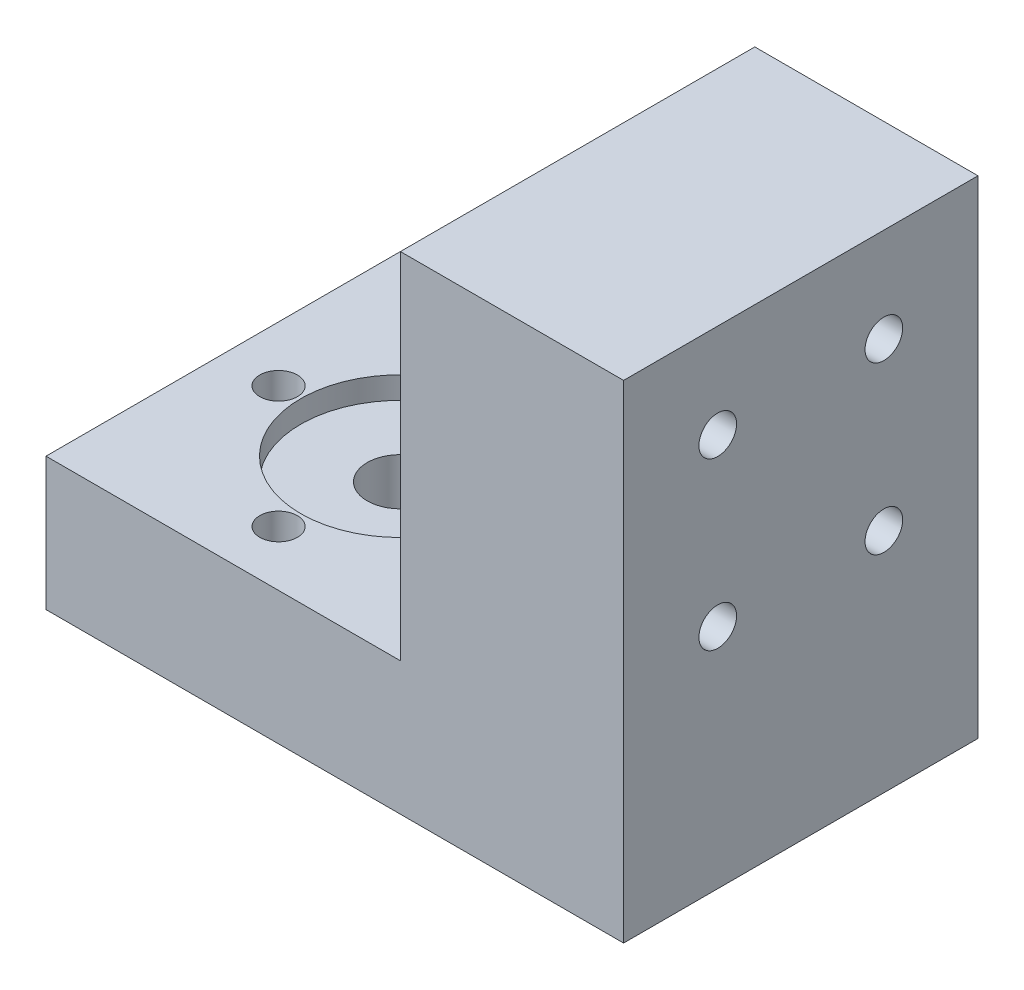
ISO-10303-21;
HEADER;
FILE_DESCRIPTION(('STEP AP214'),'2;1');
FILE_NAME('part.step','',(''),(''),'','','');
FILE_SCHEMA(('AUTOMOTIVE_DESIGN { 1 0 10303 214 1 1 1 1 }'));
ENDSEC;
DATA;
#1=APPLICATION_CONTEXT('core data for automotive mechanical design processes');
#2=APPLICATION_PROTOCOL_DEFINITION('international standard','automotive_design',2000,#1);
#3=PRODUCT_CONTEXT('',#1,'mechanical');
#4=PRODUCT('Part','Part','',(#3));
#5=PRODUCT_RELATED_PRODUCT_CATEGORY('part','',(#4));
#6=PRODUCT_DEFINITION_FORMATION('','',#4);
#7=PRODUCT_DEFINITION_CONTEXT('part definition',#1,'design');
#8=PRODUCT_DEFINITION('design','',#6,#7);
#9=PRODUCT_DEFINITION_SHAPE('','',#8);
#10=(LENGTH_UNIT() NAMED_UNIT(*) SI_UNIT(.MILLI.,.METRE.));
#11=(NAMED_UNIT(*) PLANE_ANGLE_UNIT() SI_UNIT($,.RADIAN.));
#12=(NAMED_UNIT(*) SI_UNIT($,.STERADIAN.) SOLID_ANGLE_UNIT());
#13=UNCERTAINTY_MEASURE_WITH_UNIT(LENGTH_MEASURE(1.E-05),#10,'distance_accuracy_value','');
#14=(GEOMETRIC_REPRESENTATION_CONTEXT(3) GLOBAL_UNCERTAINTY_ASSIGNED_CONTEXT((#13)) GLOBAL_UNIT_ASSIGNED_CONTEXT((#10,
#11,#12)) REPRESENTATION_CONTEXT('',''));
#15=CARTESIAN_POINT('',(0.,0.,0.));
#16=DIRECTION('',(0.,0.,1.));
#17=DIRECTION('',(1.,0.,0.));
#18=AXIS2_PLACEMENT_3D('',#15,#16,#17);
#19=CARTESIAN_POINT('',(0.,12.,0.));
#20=DIRECTION('',(-1.,0.,0.));
#21=DIRECTION('',(0.,0.,1.));
#22=AXIS2_PLACEMENT_3D('',#19,#20,#21);
#23=PLANE('',#22);
#24=DIRECTION('',(0.,0.,-1.));
#25=VECTOR('',#24,1.);
#26=CARTESIAN_POINT('',(0.,0.,0.));
#27=LINE('',#26,#25);
#28=CARTESIAN_POINT('',(0.,0.,0.));
#29=VERTEX_POINT('',#28);
#30=CARTESIAN_POINT('',(0.,0.,-32.));
#31=VERTEX_POINT('',#30);
#32=EDGE_CURVE('E120',#29,#31,#27,.T.);
#33=ORIENTED_EDGE('',*,*,#32,.F.);
#34=DIRECTION('',(0.,-1.,0.));
#35=VECTOR('',#34,1.);
#36=CARTESIAN_POINT('',(0.,12.,0.));
#37=LINE('',#36,#35);
#38=CARTESIAN_POINT('',(0.,12.,0.));
#39=VERTEX_POINT('',#38);
#40=EDGE_CURVE('E11',#39,#29,#37,.T.);
#41=ORIENTED_EDGE('',*,*,#40,.F.);
#42=DIRECTION('',(0.,0.,-1.));
#43=VECTOR('',#42,1.);
#44=CARTESIAN_POINT('',(0.,12.,0.));
#45=LINE('',#44,#43);
#46=CARTESIAN_POINT('',(0.,12.,-32.));
#47=VERTEX_POINT('',#46);
#48=EDGE_CURVE('E103',#39,#47,#45,.T.);
#49=ORIENTED_EDGE('',*,*,#48,.T.);
#50=DIRECTION('',(0.,-1.,0.));
#51=VECTOR('',#50,1.);
#52=CARTESIAN_POINT('',(0.,12.,-32.));
#53=LINE('',#52,#51);
#54=EDGE_CURVE('E50',#47,#31,#53,.T.);
#55=ORIENTED_EDGE('',*,*,#54,.T.);
#56=EDGE_LOOP('',(#33,#41,#49,#55));
#57=FACE_BOUND('',#56,.T.);
#58=ADVANCED_FACE('F47',(#57),#23,.T.);
#59=CARTESIAN_POINT('',(0.,12.,0.));
#60=DIRECTION('',(0.,0.,-1.));
#61=DIRECTION('',(-1.,0.,0.));
#62=AXIS2_PLACEMENT_3D('',#59,#60,#61);
#63=PLANE('',#62);
#64=DIRECTION('',(1.,0.,0.));
#65=VECTOR('',#64,1.);
#66=CARTESIAN_POINT('',(0.,0.,0.));
#67=LINE('',#66,#65);
#68=CARTESIAN_POINT('',(52.1521725722602,0.,0.));
#69=VERTEX_POINT('',#68);
#70=EDGE_CURVE('E107',#29,#69,#67,.T.);
#71=ORIENTED_EDGE('',*,*,#70,.T.);
#72=DIRECTION('',(0.,-1.,0.));
#73=VECTOR('',#72,1.);
#74=CARTESIAN_POINT('',(52.1521725722602,0.,0.));
#75=LINE('',#74,#73);
#76=CARTESIAN_POINT('',(52.1521725722602,44.,0.));
#77=VERTEX_POINT('',#76);
#78=EDGE_CURVE('E141',#77,#69,#75,.T.);
#79=ORIENTED_EDGE('',*,*,#78,.F.);
#80=DIRECTION('',(-1.,0.,0.));
#81=VECTOR('',#80,1.);
#82=CARTESIAN_POINT('',(52.1521725722602,44.,0.));
#83=LINE('',#82,#81);
#84=CARTESIAN_POINT('',(32.,44.,0.));
#85=VERTEX_POINT('',#84);
#86=EDGE_CURVE('E151',#77,#85,#83,.T.);
#87=ORIENTED_EDGE('',*,*,#86,.T.);
#88=DIRECTION('',(0.,-1.,0.));
#89=VECTOR('',#88,1.);
#90=CARTESIAN_POINT('',(32.,0.,0.));
#91=LINE('',#90,#89);
#92=CARTESIAN_POINT('',(32.,12.,0.));
#93=VERTEX_POINT('',#92);
#94=EDGE_CURVE('E155',#85,#93,#91,.T.);
#95=ORIENTED_EDGE('',*,*,#94,.T.);
#96=DIRECTION('',(1.,0.,0.));
#97=VECTOR('',#96,1.);
#98=CARTESIAN_POINT('',(0.,12.,0.));
#99=LINE('',#98,#97);
#100=EDGE_CURVE('E98',#39,#93,#99,.T.);
#101=ORIENTED_EDGE('',*,*,#100,.F.);
#102=ORIENTED_EDGE('',*,*,#40,.T.);
#103=EDGE_LOOP('',(#71,#79,#87,#95,#101,#102));
#104=FACE_BOUND('',#103,.T.);
#105=ADVANCED_FACE('F229',(#104),#63,.F.);
#106=CARTESIAN_POINT('',(0.,12.,-32.));
#107=DIRECTION('',(0.,0.,-1.));
#108=DIRECTION('',(-1.,0.,0.));
#109=AXIS2_PLACEMENT_3D('',#106,#107,#108);
#110=PLANE('',#109);
#111=DIRECTION('',(1.,0.,0.));
#112=VECTOR('',#111,1.);
#113=CARTESIAN_POINT('',(0.,0.,-32.));
#114=LINE('',#113,#112);
#115=CARTESIAN_POINT('',(52.1521725722602,0.,-32.));
#116=VERTEX_POINT('',#115);
#117=EDGE_CURVE('E95',#31,#116,#114,.T.);
#118=ORIENTED_EDGE('',*,*,#117,.F.);
#119=ORIENTED_EDGE('',*,*,#54,.F.);
#120=DIRECTION('',(1.,0.,0.));
#121=VECTOR('',#120,1.);
#122=CARTESIAN_POINT('',(0.,12.,-32.));
#123=LINE('',#122,#121);
#124=CARTESIAN_POINT('',(32.,12.,-32.));
#125=VERTEX_POINT('',#124);
#126=EDGE_CURVE('E92',#47,#125,#123,.T.);
#127=ORIENTED_EDGE('',*,*,#126,.T.);
#128=DIRECTION('',(0.,1.,0.));
#129=VECTOR('',#128,1.);
#130=CARTESIAN_POINT('',(32.,0.,-32.));
#131=LINE('',#130,#129);
#132=CARTESIAN_POINT('',(32.,44.,-32.));
#133=VERTEX_POINT('',#132);
#134=EDGE_CURVE('E158',#125,#133,#131,.T.);
#135=ORIENTED_EDGE('',*,*,#134,.T.);
#136=DIRECTION('',(-1.,0.,0.));
#137=VECTOR('',#136,1.);
#138=CARTESIAN_POINT('',(52.1521725722602,44.,-32.));
#139=LINE('',#138,#137);
#140=CARTESIAN_POINT('',(52.1521725722602,44.,-32.));
#141=VERTEX_POINT('',#140);
#142=EDGE_CURVE('E145',#141,#133,#139,.T.);
#143=ORIENTED_EDGE('',*,*,#142,.F.);
#144=DIRECTION('',(0.,1.,0.));
#145=VECTOR('',#144,1.);
#146=CARTESIAN_POINT('',(52.1521725722602,0.,-32.));
#147=LINE('',#146,#145);
#148=EDGE_CURVE('E138',#116,#141,#147,.T.);
#149=ORIENTED_EDGE('',*,*,#148,.F.);
#150=EDGE_LOOP('',(#118,#119,#127,#135,#143,#149));
#151=FACE_BOUND('',#150,.T.);
#152=ADVANCED_FACE('F90',(#151),#110,.T.);
#153=CARTESIAN_POINT('',(0.,12.,0.));
#154=DIRECTION('',(0.,-1.,0.));
#155=DIRECTION('',(0.,0.,-1.));
#156=AXIS2_PLACEMENT_3D('',#153,#154,#155);
#157=PLANE('',#156);
#158=CARTESIAN_POINT('',(16.,12.,-27.));
#159=DIRECTION('',(0.,1.,0.));
#160=DIRECTION('',(0.,0.,1.));
#161=AXIS2_PLACEMENT_3D('',#158,#159,#160);
#162=CIRCLE('',#161,1.7);
#163=CARTESIAN_POINT('',(16.,12.,-25.3));
#164=VERTEX_POINT('',#163);
#165=EDGE_CURVE('E177',#164,#164,#162,.T.);
#166=ORIENTED_EDGE('',*,*,#165,.F.);
#167=EDGE_LOOP('',(#166));
#168=FACE_BOUND('',#167,.T.);
#169=CARTESIAN_POINT('',(27.,12.,-16.));
#170=DIRECTION('',(0.,1.,0.));
#171=DIRECTION('',(0.,0.,1.));
#172=AXIS2_PLACEMENT_3D('',#169,#170,#171);
#173=CIRCLE('',#172,1.7);
#174=CARTESIAN_POINT('',(27.,12.,-14.3));
#175=VERTEX_POINT('',#174);
#176=EDGE_CURVE('E181',#175,#175,#173,.T.);
#177=ORIENTED_EDGE('',*,*,#176,.F.);
#178=EDGE_LOOP('',(#177));
#179=FACE_BOUND('',#178,.T.);
#180=CARTESIAN_POINT('',(16.,12.,-5.00000000000002));
#181=DIRECTION('',(0.,1.,0.));
#182=DIRECTION('',(0.,0.,1.));
#183=AXIS2_PLACEMENT_3D('',#180,#181,#182);
#184=CIRCLE('',#183,1.7);
#185=CARTESIAN_POINT('',(16.,12.,-3.30000000000002));
#186=VERTEX_POINT('',#185);
#187=EDGE_CURVE('E189',#186,#186,#184,.T.);
#188=ORIENTED_EDGE('',*,*,#187,.F.);
#189=EDGE_LOOP('',(#188));
#190=FACE_BOUND('',#189,.T.);
#191=CARTESIAN_POINT('',(5.00000000000002,12.,-16.));
#192=DIRECTION('',(0.,1.,0.));
#193=DIRECTION('',(0.,0.,1.));
#194=AXIS2_PLACEMENT_3D('',#191,#192,#193);
#195=CIRCLE('',#194,1.7);
#196=CARTESIAN_POINT('',(5.00000000000002,12.,-14.3));
#197=VERTEX_POINT('',#196);
#198=EDGE_CURVE('E197',#197,#197,#195,.T.);
#199=ORIENTED_EDGE('',*,*,#198,.F.);
#200=EDGE_LOOP('',(#199));
#201=FACE_BOUND('',#200,.T.);
#202=CARTESIAN_POINT('',(16.,12.,-16.));
#203=DIRECTION('',(0.,1.,0.));
#204=DIRECTION('',(0.,0.,1.));
#205=AXIS2_PLACEMENT_3D('',#202,#203,#204);
#206=CIRCLE('',#205,9.);
#207=CARTESIAN_POINT('',(16.,12.,-7.00000000000001));
#208=VERTEX_POINT('',#207);
#209=EDGE_CURVE('E113',#208,#208,#206,.T.);
#210=ORIENTED_EDGE('',*,*,#209,.F.);
#211=EDGE_LOOP('',(#210));
#212=FACE_BOUND('',#211,.T.);
#213=ORIENTED_EDGE('',*,*,#48,.F.);
#214=ORIENTED_EDGE('',*,*,#100,.T.);
#215=DIRECTION('',(0.,0.,-1.));
#216=VECTOR('',#215,1.);
#217=CARTESIAN_POINT('',(32.,12.,0.));
#218=LINE('',#217,#216);
#219=EDGE_CURVE('E79',#93,#125,#218,.T.);
#220=ORIENTED_EDGE('',*,*,#219,.T.);
#221=ORIENTED_EDGE('',*,*,#126,.F.);
#222=EDGE_LOOP('',(#213,#214,#220,#221));
#223=FACE_BOUND('',#222,.T.);
#224=ADVANCED_FACE('F101',(#168,#179,#190,#201,#212,#223),#157,.F.);
#225=CARTESIAN_POINT('',(0.,0.,0.));
#226=DIRECTION('',(0.,-1.,0.));
#227=DIRECTION('',(0.,0.,-1.));
#228=AXIS2_PLACEMENT_3D('',#225,#226,#227);
#229=PLANE('',#228);
#230=CARTESIAN_POINT('',(16.,0.,-27.));
#231=DIRECTION('',(0.,1.,0.));
#232=DIRECTION('',(0.,0.,1.));
#233=AXIS2_PLACEMENT_3D('',#230,#231,#232);
#234=CIRCLE('',#233,1.7);
#235=CARTESIAN_POINT('',(16.,0.,-25.3));
#236=VERTEX_POINT('',#235);
#237=EDGE_CURVE('E172',#236,#236,#234,.T.);
#238=ORIENTED_EDGE('',*,*,#237,.T.);
#239=EDGE_LOOP('',(#238));
#240=FACE_BOUND('',#239,.T.);
#241=CARTESIAN_POINT('',(27.,0.,-16.));
#242=DIRECTION('',(0.,1.,0.));
#243=DIRECTION('',(0.,0.,1.));
#244=AXIS2_PLACEMENT_3D('',#241,#242,#243);
#245=CIRCLE('',#244,1.7);
#246=CARTESIAN_POINT('',(27.,0.,-14.3));
#247=VERTEX_POINT('',#246);
#248=EDGE_CURVE('E185',#247,#247,#245,.T.);
#249=ORIENTED_EDGE('',*,*,#248,.T.);
#250=EDGE_LOOP('',(#249));
#251=FACE_BOUND('',#250,.T.);
#252=CARTESIAN_POINT('',(16.,0.,-5.00000000000002));
#253=DIRECTION('',(0.,1.,0.));
#254=DIRECTION('',(0.,0.,1.));
#255=AXIS2_PLACEMENT_3D('',#252,#253,#254);
#256=CIRCLE('',#255,1.7);
#257=CARTESIAN_POINT('',(16.,0.,-3.30000000000002));
#258=VERTEX_POINT('',#257);
#259=EDGE_CURVE('E193',#258,#258,#256,.T.);
#260=ORIENTED_EDGE('',*,*,#259,.T.);
#261=EDGE_LOOP('',(#260));
#262=FACE_BOUND('',#261,.T.);
#263=CARTESIAN_POINT('',(5.00000000000002,0.,-16.));
#264=DIRECTION('',(0.,1.,0.));
#265=DIRECTION('',(0.,0.,1.));
#266=AXIS2_PLACEMENT_3D('',#263,#264,#265);
#267=CIRCLE('',#266,1.7);
#268=CARTESIAN_POINT('',(5.00000000000002,0.,-14.3));
#269=VERTEX_POINT('',#268);
#270=EDGE_CURVE('E171',#269,#269,#267,.T.);
#271=ORIENTED_EDGE('',*,*,#270,.T.);
#272=EDGE_LOOP('',(#271));
#273=FACE_BOUND('',#272,.T.);
#274=CARTESIAN_POINT('',(16.,0.,-16.));
#275=DIRECTION('',(0.,1.,0.));
#276=DIRECTION('',(0.,0.,1.));
#277=AXIS2_PLACEMENT_3D('',#274,#275,#276);
#278=CIRCLE('',#277,3.);
#279=CARTESIAN_POINT('',(16.,0.,-13.));
#280=VERTEX_POINT('',#279);
#281=EDGE_CURVE('E204',#280,#280,#278,.T.);
#282=ORIENTED_EDGE('',*,*,#281,.T.);
#283=EDGE_LOOP('',(#282));
#284=FACE_BOUND('',#283,.T.);
#285=ORIENTED_EDGE('',*,*,#32,.T.);
#286=ORIENTED_EDGE('',*,*,#117,.T.);
#287=DIRECTION('',(0.,0.,-1.));
#288=VECTOR('',#287,1.);
#289=CARTESIAN_POINT('',(52.1521725722602,0.,0.));
#290=LINE('',#289,#288);
#291=EDGE_CURVE('E132',#69,#116,#290,.T.);
#292=ORIENTED_EDGE('',*,*,#291,.F.);
#293=ORIENTED_EDGE('',*,*,#70,.F.);
#294=EDGE_LOOP('',(#285,#286,#292,#293));
#295=FACE_BOUND('',#294,.T.);
#296=ADVANCED_FACE('F129',(#240,#251,#262,#273,#284,#295),#229,.T.);
#297=CARTESIAN_POINT('',(16.,10.,-16.));
#298=DIRECTION('',(0.,1.,0.));
#299=DIRECTION('',(0.,0.,1.));
#300=AXIS2_PLACEMENT_3D('',#297,#298,#299);
#301=CYLINDRICAL_SURFACE('',#300,9.);
#302=CARTESIAN_POINT('',(16.,10.,-16.));
#303=DIRECTION('',(0.,1.,0.));
#304=DIRECTION('',(0.,0.,1.));
#305=AXIS2_PLACEMENT_3D('',#302,#303,#304);
#306=CIRCLE('',#305,9.);
#307=CARTESIAN_POINT('',(16.,10.,-7.00000000000001));
#308=VERTEX_POINT('',#307);
#309=EDGE_CURVE('E123',#308,#308,#306,.T.);
#310=ORIENTED_EDGE('',*,*,#309,.F.);
#311=EDGE_LOOP('',(#310));
#312=FACE_BOUND('',#311,.T.);
#313=ORIENTED_EDGE('',*,*,#209,.T.);
#314=EDGE_LOOP('',(#313));
#315=FACE_BOUND('',#314,.T.);
#316=ADVANCED_FACE('F218',(#312,#315),#301,.F.);
#317=CARTESIAN_POINT('',(16.,10.,-16.));
#318=DIRECTION('',(0.,1.,0.));
#319=DIRECTION('',(0.,0.,1.));
#320=AXIS2_PLACEMENT_3D('',#317,#318,#319);
#321=PLANE('',#320);
#322=CARTESIAN_POINT('',(16.,10.,-16.));
#323=DIRECTION('',(0.,1.,0.));
#324=DIRECTION('',(0.,0.,1.));
#325=AXIS2_PLACEMENT_3D('',#322,#323,#324);
#326=CIRCLE('',#325,3.);
#327=CARTESIAN_POINT('',(16.,10.,-13.));
#328=VERTEX_POINT('',#327);
#329=EDGE_CURVE('E176',#328,#328,#326,.T.);
#330=ORIENTED_EDGE('',*,*,#329,.F.);
#331=EDGE_LOOP('',(#330));
#332=FACE_BOUND('',#331,.T.);
#333=ORIENTED_EDGE('',*,*,#309,.T.);
#334=EDGE_LOOP('',(#333));
#335=FACE_BOUND('',#334,.T.);
#336=ADVANCED_FACE('F282',(#332,#335),#321,.T.);
#337=CARTESIAN_POINT('',(16.,0.,-16.));
#338=DIRECTION('',(0.,1.,0.));
#339=DIRECTION('',(0.,0.,1.));
#340=AXIS2_PLACEMENT_3D('',#337,#338,#339);
#341=CYLINDRICAL_SURFACE('',#340,3.);
#342=ORIENTED_EDGE('',*,*,#281,.F.);
#343=EDGE_LOOP('',(#342));
#344=FACE_BOUND('',#343,.T.);
#345=ORIENTED_EDGE('',*,*,#329,.T.);
#346=EDGE_LOOP('',(#345));
#347=FACE_BOUND('',#346,.T.);
#348=ADVANCED_FACE('F278',(#344,#347),#341,.F.);
#349=CARTESIAN_POINT('',(5.00000000000002,0.,-16.));
#350=DIRECTION('',(0.,1.,0.));
#351=DIRECTION('',(0.,0.,1.));
#352=AXIS2_PLACEMENT_3D('',#349,#350,#351);
#353=CYLINDRICAL_SURFACE('',#352,1.7);
#354=ORIENTED_EDGE('',*,*,#270,.F.);
#355=EDGE_LOOP('',(#354));
#356=FACE_BOUND('',#355,.T.);
#357=ORIENTED_EDGE('',*,*,#198,.T.);
#358=EDGE_LOOP('',(#357));
#359=FACE_BOUND('',#358,.T.);
#360=ADVANCED_FACE('F274',(#356,#359),#353,.F.);
#361=CARTESIAN_POINT('',(16.,0.,-5.00000000000002));
#362=DIRECTION('',(0.,1.,0.));
#363=DIRECTION('',(0.,0.,1.));
#364=AXIS2_PLACEMENT_3D('',#361,#362,#363);
#365=CYLINDRICAL_SURFACE('',#364,1.7);
#366=ORIENTED_EDGE('',*,*,#259,.F.);
#367=EDGE_LOOP('',(#366));
#368=FACE_BOUND('',#367,.T.);
#369=ORIENTED_EDGE('',*,*,#187,.T.);
#370=EDGE_LOOP('',(#369));
#371=FACE_BOUND('',#370,.T.);
#372=ADVANCED_FACE('F270',(#368,#371),#365,.F.);
#373=CARTESIAN_POINT('',(27.,0.,-16.));
#374=DIRECTION('',(0.,1.,0.));
#375=DIRECTION('',(0.,0.,1.));
#376=AXIS2_PLACEMENT_3D('',#373,#374,#375);
#377=CYLINDRICAL_SURFACE('',#376,1.7);
#378=ORIENTED_EDGE('',*,*,#248,.F.);
#379=EDGE_LOOP('',(#378));
#380=FACE_BOUND('',#379,.T.);
#381=ORIENTED_EDGE('',*,*,#176,.T.);
#382=EDGE_LOOP('',(#381));
#383=FACE_BOUND('',#382,.T.);
#384=ADVANCED_FACE('F260',(#380,#383),#377,.F.);
#385=CARTESIAN_POINT('',(16.,0.,-27.));
#386=DIRECTION('',(0.,1.,0.));
#387=DIRECTION('',(0.,0.,1.));
#388=AXIS2_PLACEMENT_3D('',#385,#386,#387);
#389=CYLINDRICAL_SURFACE('',#388,1.7);
#390=ORIENTED_EDGE('',*,*,#237,.F.);
#391=EDGE_LOOP('',(#390));
#392=FACE_BOUND('',#391,.T.);
#393=ORIENTED_EDGE('',*,*,#165,.T.);
#394=EDGE_LOOP('',(#393));
#395=FACE_BOUND('',#394,.T.);
#396=ADVANCED_FACE('F252',(#392,#395),#389,.F.);
#397=CARTESIAN_POINT('',(32.,0.,0.));
#398=DIRECTION('',(-1.,0.,0.));
#399=DIRECTION('',(0.,0.,1.));
#400=AXIS2_PLACEMENT_3D('',#397,#398,#399);
#401=PLANE('',#400);
#402=CARTESIAN_POINT('',(32.,20.5,-23.5));
#403=DIRECTION('',(-1.,0.,0.));
#404=DIRECTION('',(0.,0.,1.));
#405=AXIS2_PLACEMENT_3D('',#402,#403,#404);
#406=CIRCLE('',#405,1.7);
#407=CARTESIAN_POINT('',(32.,20.5,-21.8));
#408=VERTEX_POINT('',#407);
#409=EDGE_CURVE('E406',#408,#408,#406,.T.);
#410=ORIENTED_EDGE('',*,*,#409,.F.);
#411=EDGE_LOOP('',(#410));
#412=FACE_BOUND('',#411,.T.);
#413=CARTESIAN_POINT('',(32.,20.5,-8.50000000000001));
#414=DIRECTION('',(-1.,0.,0.));
#415=DIRECTION('',(0.,0.,1.));
#416=AXIS2_PLACEMENT_3D('',#413,#414,#415);
#417=CIRCLE('',#416,1.7);
#418=CARTESIAN_POINT('',(32.,20.5,-6.80000000000001));
#419=VERTEX_POINT('',#418);
#420=EDGE_CURVE('E413',#419,#419,#417,.T.);
#421=ORIENTED_EDGE('',*,*,#420,.F.);
#422=EDGE_LOOP('',(#421));
#423=FACE_BOUND('',#422,.T.);
#424=CARTESIAN_POINT('',(32.,35.5,-8.50000000000001));
#425=DIRECTION('',(-1.,0.,0.));
#426=DIRECTION('',(0.,0.,1.));
#427=AXIS2_PLACEMENT_3D('',#424,#425,#426);
#428=CIRCLE('',#427,1.7);
#429=CARTESIAN_POINT('',(32.,35.5,-6.80000000000001));
#430=VERTEX_POINT('',#429);
#431=EDGE_CURVE('E424',#430,#430,#428,.T.);
#432=ORIENTED_EDGE('',*,*,#431,.F.);
#433=EDGE_LOOP('',(#432));
#434=FACE_BOUND('',#433,.T.);
#435=CARTESIAN_POINT('',(32.,35.5,-23.5));
#436=DIRECTION('',(-1.,0.,0.));
#437=DIRECTION('',(0.,0.,1.));
#438=AXIS2_PLACEMENT_3D('',#435,#436,#437);
#439=CIRCLE('',#438,1.7);
#440=CARTESIAN_POINT('',(32.,35.5,-21.8));
#441=VERTEX_POINT('',#440);
#442=EDGE_CURVE('E421',#441,#441,#439,.T.);
#443=ORIENTED_EDGE('',*,*,#442,.F.);
#444=EDGE_LOOP('',(#443));
#445=FACE_BOUND('',#444,.T.);
#446=ORIENTED_EDGE('',*,*,#219,.F.);
#447=ORIENTED_EDGE('',*,*,#94,.F.);
#448=DIRECTION('',(0.,0.,1.));
#449=VECTOR('',#448,1.);
#450=CARTESIAN_POINT('',(32.,44.,0.));
#451=LINE('',#450,#449);
#452=EDGE_CURVE('E162',#133,#85,#451,.T.);
#453=ORIENTED_EDGE('',*,*,#452,.F.);
#454=ORIENTED_EDGE('',*,*,#134,.F.);
#455=EDGE_LOOP('',(#446,#447,#453,#454));
#456=FACE_BOUND('',#455,.T.);
#457=ADVANCED_FACE('F250',(#412,#423,#434,#445,#456),#401,.T.);
#458=CARTESIAN_POINT('',(52.1521725722602,44.,0.));
#459=DIRECTION('',(0.,-1.,0.));
#460=DIRECTION('',(0.,0.,-1.));
#461=AXIS2_PLACEMENT_3D('',#458,#459,#460);
#462=PLANE('',#461);
#463=ORIENTED_EDGE('',*,*,#452,.T.);
#464=ORIENTED_EDGE('',*,*,#86,.F.);
#465=DIRECTION('',(0.,0.,1.));
#466=VECTOR('',#465,1.);
#467=CARTESIAN_POINT('',(52.1521725722602,44.,0.));
#468=LINE('',#467,#466);
#469=EDGE_CURVE('E148',#141,#77,#468,.T.);
#470=ORIENTED_EDGE('',*,*,#469,.F.);
#471=ORIENTED_EDGE('',*,*,#142,.T.);
#472=EDGE_LOOP('',(#463,#464,#470,#471));
#473=FACE_BOUND('',#472,.T.);
#474=ADVANCED_FACE('F248',(#473),#462,.F.);
#475=CARTESIAN_POINT('',(52.1521725722602,0.,0.));
#476=DIRECTION('',(-1.,0.,0.));
#477=DIRECTION('',(0.,0.,1.));
#478=AXIS2_PLACEMENT_3D('',#475,#476,#477);
#479=PLANE('',#478);
#480=CARTESIAN_POINT('',(52.1521725722602,20.5,-23.5));
#481=DIRECTION('',(-1.,0.,0.));
#482=DIRECTION('',(0.,0.,1.));
#483=AXIS2_PLACEMENT_3D('',#480,#481,#482);
#484=CIRCLE('',#483,1.7);
#485=CARTESIAN_POINT('',(52.1521725722602,20.5,-21.8));
#486=VERTEX_POINT('',#485);
#487=EDGE_CURVE('E404',#486,#486,#484,.T.);
#488=ORIENTED_EDGE('',*,*,#487,.T.);
#489=EDGE_LOOP('',(#488));
#490=FACE_BOUND('',#489,.T.);
#491=CARTESIAN_POINT('',(52.1521725722602,20.5,-8.50000000000001));
#492=DIRECTION('',(-1.,0.,0.));
#493=DIRECTION('',(0.,0.,1.));
#494=AXIS2_PLACEMENT_3D('',#491,#492,#493);
#495=CIRCLE('',#494,1.7);
#496=CARTESIAN_POINT('',(52.1521725722602,20.5,-6.80000000000001));
#497=VERTEX_POINT('',#496);
#498=EDGE_CURVE('E408',#497,#497,#495,.T.);
#499=ORIENTED_EDGE('',*,*,#498,.T.);
#500=EDGE_LOOP('',(#499));
#501=FACE_BOUND('',#500,.T.);
#502=CARTESIAN_POINT('',(52.1521725722602,35.5,-8.50000000000001));
#503=DIRECTION('',(-1.,0.,0.));
#504=DIRECTION('',(0.,0.,1.));
#505=AXIS2_PLACEMENT_3D('',#502,#503,#504);
#506=CIRCLE('',#505,1.7);
#507=CARTESIAN_POINT('',(52.1521725722602,35.5,-6.80000000000001));
#508=VERTEX_POINT('',#507);
#509=EDGE_CURVE('E429',#508,#508,#506,.T.);
#510=ORIENTED_EDGE('',*,*,#509,.T.);
#511=EDGE_LOOP('',(#510));
#512=FACE_BOUND('',#511,.T.);
#513=CARTESIAN_POINT('',(52.1521725722602,35.5,-23.5));
#514=DIRECTION('',(-1.,0.,0.));
#515=DIRECTION('',(0.,0.,1.));
#516=AXIS2_PLACEMENT_3D('',#513,#514,#515);
#517=CIRCLE('',#516,1.7);
#518=CARTESIAN_POINT('',(52.1521725722602,35.5,-21.8));
#519=VERTEX_POINT('',#518);
#520=EDGE_CURVE('E159',#519,#519,#517,.T.);
#521=ORIENTED_EDGE('',*,*,#520,.T.);
#522=EDGE_LOOP('',(#521));
#523=FACE_BOUND('',#522,.T.);
#524=ORIENTED_EDGE('',*,*,#78,.T.);
#525=ORIENTED_EDGE('',*,*,#291,.T.);
#526=ORIENTED_EDGE('',*,*,#148,.T.);
#527=ORIENTED_EDGE('',*,*,#469,.T.);
#528=EDGE_LOOP('',(#524,#525,#526,#527));
#529=FACE_BOUND('',#528,.T.);
#530=ADVANCED_FACE('F137',(#490,#501,#512,#523,#529),#479,.F.);
#531=CARTESIAN_POINT('',(52.1521725722602,35.5,-23.5));
#532=DIRECTION('',(-1.,0.,0.));
#533=DIRECTION('',(0.,0.,1.));
#534=AXIS2_PLACEMENT_3D('',#531,#532,#533);
#535=CYLINDRICAL_SURFACE('',#534,1.7);
#536=ORIENTED_EDGE('',*,*,#520,.F.);
#537=EDGE_LOOP('',(#536));
#538=FACE_BOUND('',#537,.T.);
#539=ORIENTED_EDGE('',*,*,#442,.T.);
#540=EDGE_LOOP('',(#539));
#541=FACE_BOUND('',#540,.T.);
#542=ADVANCED_FACE('F360',(#538,#541),#535,.F.);
#543=CARTESIAN_POINT('',(52.1521725722602,35.5,-8.50000000000001));
#544=DIRECTION('',(-1.,0.,0.));
#545=DIRECTION('',(0.,0.,1.));
#546=AXIS2_PLACEMENT_3D('',#543,#544,#545);
#547=CYLINDRICAL_SURFACE('',#546,1.7);
#548=ORIENTED_EDGE('',*,*,#509,.F.);
#549=EDGE_LOOP('',(#548));
#550=FACE_BOUND('',#549,.T.);
#551=ORIENTED_EDGE('',*,*,#431,.T.);
#552=EDGE_LOOP('',(#551));
#553=FACE_BOUND('',#552,.T.);
#554=ADVANCED_FACE('F369',(#550,#553),#547,.F.);
#555=CARTESIAN_POINT('',(52.1521725722602,20.5,-8.50000000000001));
#556=DIRECTION('',(-1.,0.,0.));
#557=DIRECTION('',(0.,0.,1.));
#558=AXIS2_PLACEMENT_3D('',#555,#556,#557);
#559=CYLINDRICAL_SURFACE('',#558,1.7);
#560=ORIENTED_EDGE('',*,*,#498,.F.);
#561=EDGE_LOOP('',(#560));
#562=FACE_BOUND('',#561,.T.);
#563=ORIENTED_EDGE('',*,*,#420,.T.);
#564=EDGE_LOOP('',(#563));
#565=FACE_BOUND('',#564,.T.);
#566=ADVANCED_FACE('F378',(#562,#565),#559,.F.);
#567=CARTESIAN_POINT('',(52.1521725722602,20.5,-23.5));
#568=DIRECTION('',(-1.,0.,0.));
#569=DIRECTION('',(0.,0.,1.));
#570=AXIS2_PLACEMENT_3D('',#567,#568,#569);
#571=CYLINDRICAL_SURFACE('',#570,1.7);
#572=ORIENTED_EDGE('',*,*,#487,.F.);
#573=EDGE_LOOP('',(#572));
#574=FACE_BOUND('',#573,.T.);
#575=ORIENTED_EDGE('',*,*,#409,.T.);
#576=EDGE_LOOP('',(#575));
#577=FACE_BOUND('',#576,.T.);
#578=ADVANCED_FACE('F388',(#574,#577),#571,.F.);
#579=CLOSED_SHELL('',(#58,#105,#152,#224,#296,#316,#336,#348,#360,#372,#384,#396,#457,#474,#530,
#542,#554,#566,#578));
#580=MANIFOLD_SOLID_BREP('B2',#579);
#581=ADVANCED_BREP_SHAPE_REPRESENTATION('',(#18,#580),#14);
#582=SHAPE_DEFINITION_REPRESENTATION(#9,#581);
ENDSEC;
END-ISO-10303-21;
